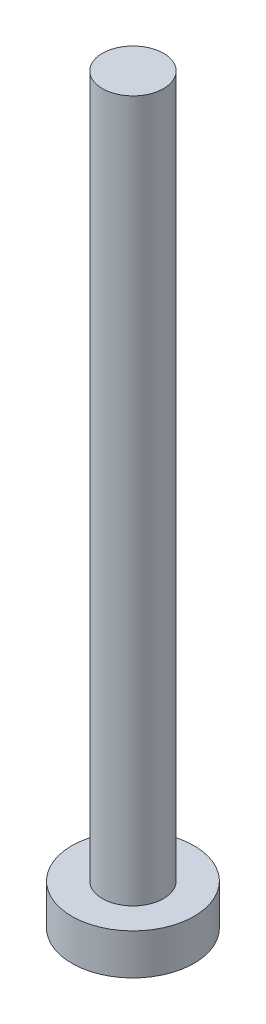
ISO-10303-21;
HEADER;
FILE_DESCRIPTION(('STEP AP214'),'2;1');
FILE_NAME('part.step','',(''),(''),'','','');
FILE_SCHEMA(('AUTOMOTIVE_DESIGN { 1 0 10303 214 1 1 1 1 }'));
ENDSEC;
DATA;
#1=APPLICATION_CONTEXT('core data for automotive mechanical design processes');
#2=APPLICATION_PROTOCOL_DEFINITION('international standard','automotive_design',2000,#1);
#3=PRODUCT_CONTEXT('',#1,'mechanical');
#4=PRODUCT('Part','Part','',(#3));
#5=PRODUCT_RELATED_PRODUCT_CATEGORY('part','',(#4));
#6=PRODUCT_DEFINITION_FORMATION('','',#4);
#7=PRODUCT_DEFINITION_CONTEXT('part definition',#1,'design');
#8=PRODUCT_DEFINITION('design','',#6,#7);
#9=PRODUCT_DEFINITION_SHAPE('','',#8);
#10=(LENGTH_UNIT() NAMED_UNIT(*) SI_UNIT(.MILLI.,.METRE.));
#11=(NAMED_UNIT(*) PLANE_ANGLE_UNIT() SI_UNIT($,.RADIAN.));
#12=(NAMED_UNIT(*) SI_UNIT($,.STERADIAN.) SOLID_ANGLE_UNIT());
#13=UNCERTAINTY_MEASURE_WITH_UNIT(LENGTH_MEASURE(1.E-05),#10,'distance_accuracy_value','');
#14=(GEOMETRIC_REPRESENTATION_CONTEXT(3) GLOBAL_UNCERTAINTY_ASSIGNED_CONTEXT((#13)) GLOBAL_UNIT_ASSIGNED_CONTEXT((#10,
#11,#12)) REPRESENTATION_CONTEXT('',''));
#15=CARTESIAN_POINT('',(0.,0.,0.));
#16=DIRECTION('',(0.,0.,1.));
#17=DIRECTION('',(1.,0.,0.));
#18=AXIS2_PLACEMENT_3D('',#15,#16,#17);
#19=CARTESIAN_POINT('',(3.01,-56.42,3.01));
#20=DIRECTION('',(0.,-1.,0.));
#21=DIRECTION('',(-1.,0.,0.));
#22=AXIS2_PLACEMENT_3D('',#19,#20,#21);
#23=PLANE('',#22);
#24=CARTESIAN_POINT('',(0.,-56.42,0.));
#25=DIRECTION('',(0.,-1.,0.));
#26=DIRECTION('',(-1.,0.,0.));
#27=AXIS2_PLACEMENT_3D('',#24,#25,#26);
#28=CIRCLE('',#27,3.);
#29=CARTESIAN_POINT('',(-3.,-56.42,0.));
#30=VERTEX_POINT('',#29);
#31=EDGE_CURVE('E70',#30,#30,#28,.T.);
#32=ORIENTED_EDGE('',*,*,#31,.T.);
#33=EDGE_LOOP('',(#32));
#34=FACE_BOUND('',#33,.T.);
#35=ADVANCED_FACE('F40',(#34),#23,.T.);
#36=CARTESIAN_POINT('',(0.,-20.,0.));
#37=DIRECTION('',(0.,-1.,0.));
#38=DIRECTION('',(0.,0.,-1.));
#39=AXIS2_PLACEMENT_3D('',#36,#37,#38);
#40=CYLINDRICAL_SURFACE('',#39,1.5);
#41=CARTESIAN_POINT('',(0.,-54.42,0.));
#42=DIRECTION('',(0.,1.,0.));
#43=DIRECTION('',(-1.,0.,0.));
#44=AXIS2_PLACEMENT_3D('',#41,#42,#43);
#45=CIRCLE('',#44,1.5);
#46=CARTESIAN_POINT('',(-1.5,-54.42,0.));
#47=VERTEX_POINT('',#46);
#48=EDGE_CURVE('E88',#47,#47,#45,.T.);
#49=ORIENTED_EDGE('',*,*,#48,.T.);
#50=DIRECTION('',(0.,1.,0.));
#51=VECTOR('',#50,1.);
#52=CARTESIAN_POINT('',(-1.5,-37.21,0.));
#53=LINE('',#52,#51);
#54=CARTESIAN_POINT('',(-1.5,-20.,0.));
#55=VERTEX_POINT('',#54);
#56=EDGE_CURVE('E11',#47,#55,#53,.T.);
#57=ORIENTED_EDGE('',*,*,#56,.T.);
#58=CARTESIAN_POINT('',(0.,-20.,0.));
#59=DIRECTION('',(0.,1.,0.));
#60=DIRECTION('',(-1.,0.,0.));
#61=AXIS2_PLACEMENT_3D('',#58,#59,#60);
#62=CIRCLE('',#61,1.5);
#63=EDGE_CURVE('E51',#55,#55,#62,.T.);
#64=ORIENTED_EDGE('',*,*,#63,.F.);
#65=ORIENTED_EDGE('',*,*,#56,.F.);
#66=EDGE_LOOP('',(#49,#57,#64,#65));
#67=FACE_BOUND('',#66,.T.);
#68=ADVANCED_FACE('F103',(#67),#40,.T.);
#69=CARTESIAN_POINT('',(-1.51,-20.,1.51));
#70=DIRECTION('',(0.,1.,0.));
#71=DIRECTION('',(1.,0.,0.));
#72=AXIS2_PLACEMENT_3D('',#69,#70,#71);
#73=PLANE('',#72);
#74=ORIENTED_EDGE('',*,*,#63,.T.);
#75=EDGE_LOOP('',(#74));
#76=FACE_BOUND('',#75,.T.);
#77=ADVANCED_FACE('F96',(#76),#73,.T.);
#78=CARTESIAN_POINT('',(3.01,-54.42,-3.01));
#79=DIRECTION('',(0.,1.,0.));
#80=DIRECTION('',(-1.,0.,0.));
#81=AXIS2_PLACEMENT_3D('',#78,#79,#80);
#82=PLANE('',#81);
#83=ORIENTED_EDGE('',*,*,#48,.F.);
#84=EDGE_LOOP('',(#83));
#85=FACE_BOUND('',#84,.T.);
#86=CARTESIAN_POINT('',(0.,-54.42,0.));
#87=DIRECTION('',(0.,1.,0.));
#88=DIRECTION('',(-1.,0.,0.));
#89=AXIS2_PLACEMENT_3D('',#86,#87,#88);
#90=CIRCLE('',#89,3.);
#91=CARTESIAN_POINT('',(-3.,-54.42,0.));
#92=VERTEX_POINT('',#91);
#93=EDGE_CURVE('E44',#92,#92,#90,.T.);
#94=ORIENTED_EDGE('',*,*,#93,.T.);
#95=EDGE_LOOP('',(#94));
#96=FACE_BOUND('',#95,.T.);
#97=ADVANCED_FACE('F73',(#85,#96),#82,.T.);
#98=CARTESIAN_POINT('',(0.,-54.42,0.));
#99=DIRECTION('',(0.,-1.,0.));
#100=DIRECTION('',(0.,0.,-1.));
#101=AXIS2_PLACEMENT_3D('',#98,#99,#100);
#102=CYLINDRICAL_SURFACE('',#101,3.);
#103=ORIENTED_EDGE('',*,*,#93,.F.);
#104=DIRECTION('',(0.,-1.,0.));
#105=VECTOR('',#104,1.);
#106=CARTESIAN_POINT('',(-3.,-55.42,0.));
#107=LINE('',#106,#105);
#108=EDGE_CURVE('E68',#92,#30,#107,.T.);
#109=ORIENTED_EDGE('',*,*,#108,.T.);
#110=ORIENTED_EDGE('',*,*,#31,.F.);
#111=ORIENTED_EDGE('',*,*,#108,.F.);
#112=EDGE_LOOP('',(#103,#109,#110,#111));
#113=FACE_BOUND('',#112,.T.);
#114=ADVANCED_FACE('F42',(#113),#102,.T.);
#115=CLOSED_SHELL('',(#35,#68,#77,#97,#114));
#116=MANIFOLD_SOLID_BREP('B2',#115);
#117=ADVANCED_BREP_SHAPE_REPRESENTATION('',(#18,#116),#14);
#118=SHAPE_DEFINITION_REPRESENTATION(#9,#117);
ENDSEC;
END-ISO-10303-21;
